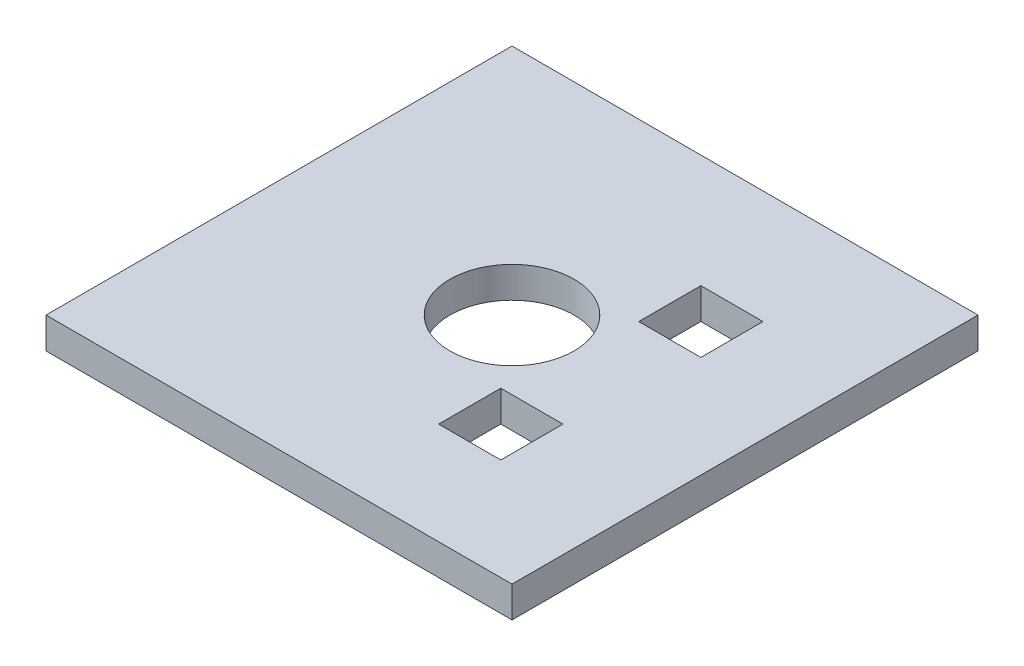
ISO-10303-21;
HEADER;
FILE_DESCRIPTION(('STEP AP214'),'2;1');
FILE_NAME('part.step','',(''),(''),'','','');
FILE_SCHEMA(('AUTOMOTIVE_DESIGN { 1 0 10303 214 1 1 1 1 }'));
ENDSEC;
DATA;
#1=APPLICATION_CONTEXT('core data for automotive mechanical design processes');
#2=APPLICATION_PROTOCOL_DEFINITION('international standard','automotive_design',2000,#1);
#3=PRODUCT_CONTEXT('',#1,'mechanical');
#4=PRODUCT('Part','Part','',(#3));
#5=PRODUCT_RELATED_PRODUCT_CATEGORY('part','',(#4));
#6=PRODUCT_DEFINITION_FORMATION('','',#4);
#7=PRODUCT_DEFINITION_CONTEXT('part definition',#1,'design');
#8=PRODUCT_DEFINITION('design','',#6,#7);
#9=PRODUCT_DEFINITION_SHAPE('','',#8);
#10=(LENGTH_UNIT() NAMED_UNIT(*) SI_UNIT(.MILLI.,.METRE.));
#11=(NAMED_UNIT(*) PLANE_ANGLE_UNIT() SI_UNIT($,.RADIAN.));
#12=(NAMED_UNIT(*) SI_UNIT($,.STERADIAN.) SOLID_ANGLE_UNIT());
#13=UNCERTAINTY_MEASURE_WITH_UNIT(LENGTH_MEASURE(1.E-05),#10,'distance_accuracy_value','');
#14=(GEOMETRIC_REPRESENTATION_CONTEXT(3) GLOBAL_UNCERTAINTY_ASSIGNED_CONTEXT((#13)) GLOBAL_UNIT_ASSIGNED_CONTEXT((#10,
#11,#12)) REPRESENTATION_CONTEXT('',''));
#15=CARTESIAN_POINT('',(0.,0.,0.));
#16=DIRECTION('',(0.,0.,1.));
#17=DIRECTION('',(1.,0.,0.));
#18=AXIS2_PLACEMENT_3D('',#15,#16,#17);
#19=CARTESIAN_POINT('',(0.,10.,0.));
#20=DIRECTION('',(0.,-1.,0.));
#21=DIRECTION('',(0.,0.,-1.));
#22=AXIS2_PLACEMENT_3D('',#19,#20,#21);
#23=PLANE('',#22);
#24=DIRECTION('',(-1.,0.,0.));
#25=VECTOR('',#24,1.);
#26=CARTESIAN_POINT('',(38.5873477613194,10.,22.2049116139431));
#27=LINE('',#26,#25);
#28=CARTESIAN_POINT('',(38.5873477613194,10.,22.2049116139431));
#29=VERTEX_POINT('',#28);
#30=CARTESIAN_POINT('',(18.5873477613194,10.,22.2049116139431));
#31=VERTEX_POINT('',#30);
#32=EDGE_CURVE('E149',#29,#31,#27,.T.);
#33=ORIENTED_EDGE('',*,*,#32,.F.);
#34=DIRECTION('',(0.,0.,-1.));
#35=VECTOR('',#34,1.);
#36=CARTESIAN_POINT('',(38.5873477613194,10.,42.2049116139431));
#37=LINE('',#36,#35);
#38=CARTESIAN_POINT('',(38.5873477613194,10.,42.2049116139431));
#39=VERTEX_POINT('',#38);
#40=EDGE_CURVE('E48',#39,#29,#37,.T.);
#41=ORIENTED_EDGE('',*,*,#40,.F.);
#42=DIRECTION('',(1.,0.,0.));
#43=VECTOR('',#42,1.);
#44=CARTESIAN_POINT('',(38.5873477613194,10.,42.2049116139431));
#45=LINE('',#44,#43);
#46=CARTESIAN_POINT('',(18.5873477613194,10.,42.2049116139431));
#47=VERTEX_POINT('',#46);
#48=EDGE_CURVE('E140',#47,#39,#45,.T.);
#49=ORIENTED_EDGE('',*,*,#48,.F.);
#50=DIRECTION('',(0.,0.,1.));
#51=VECTOR('',#50,1.);
#52=CARTESIAN_POINT('',(18.5873477613194,10.,42.2049116139431));
#53=LINE('',#52,#51);
#54=EDGE_CURVE('E143',#31,#47,#53,.T.);
#55=ORIENTED_EDGE('',*,*,#54,.F.);
#56=EDGE_LOOP('',(#33,#41,#49,#55));
#57=FACE_BOUND('',#56,.T.);
#58=DIRECTION('',(0.,0.,1.));
#59=VECTOR('',#58,1.);
#60=CARTESIAN_POINT('',(22.204911613943,10.,-38.5873477613194));
#61=LINE('',#60,#59);
#62=CARTESIAN_POINT('',(22.204911613943,10.,-38.5873477613194));
#63=VERTEX_POINT('',#62);
#64=CARTESIAN_POINT('',(22.204911613943,10.,-18.5873477613194));
#65=VERTEX_POINT('',#64);
#66=EDGE_CURVE('E174',#63,#65,#61,.T.);
#67=ORIENTED_EDGE('',*,*,#66,.F.);
#68=DIRECTION('',(-1.,0.,0.));
#69=VECTOR('',#68,1.);
#70=CARTESIAN_POINT('',(42.204911613943,10.,-38.5873477613194));
#71=LINE('',#70,#69);
#72=CARTESIAN_POINT('',(42.204911613943,10.,-38.5873477613194));
#73=VERTEX_POINT('',#72);
#74=EDGE_CURVE('E155',#73,#63,#71,.T.);
#75=ORIENTED_EDGE('',*,*,#74,.F.);
#76=DIRECTION('',(0.,0.,-1.));
#77=VECTOR('',#76,1.);
#78=CARTESIAN_POINT('',(42.204911613943,10.,-38.5873477613194));
#79=LINE('',#78,#77);
#80=CARTESIAN_POINT('',(42.204911613943,10.,-18.5873477613194));
#81=VERTEX_POINT('',#80);
#82=EDGE_CURVE('E163',#81,#73,#79,.T.);
#83=ORIENTED_EDGE('',*,*,#82,.F.);
#84=DIRECTION('',(1.,0.,0.));
#85=VECTOR('',#84,1.);
#86=CARTESIAN_POINT('',(42.204911613943,10.,-18.5873477613194));
#87=LINE('',#86,#85);
#88=EDGE_CURVE('E177',#65,#81,#87,.T.);
#89=ORIENTED_EDGE('',*,*,#88,.F.);
#90=EDGE_LOOP('',(#67,#75,#83,#89));
#91=FACE_BOUND('',#90,.T.);
#92=DIRECTION('',(0.,0.,-1.));
#93=VECTOR('',#92,1.);
#94=CARTESIAN_POINT('',(75.,10.,75.));
#95=LINE('',#94,#93);
#96=CARTESIAN_POINT('',(75.,10.,75.));
#97=VERTEX_POINT('',#96);
#98=CARTESIAN_POINT('',(75.,10.,-75.));
#99=VERTEX_POINT('',#98);
#100=EDGE_CURVE('E197',#97,#99,#95,.T.);
#101=ORIENTED_EDGE('',*,*,#100,.T.);
#102=DIRECTION('',(-1.,0.,0.));
#103=VECTOR('',#102,1.);
#104=CARTESIAN_POINT('',(-75.,10.,-75.));
#105=LINE('',#104,#103);
#106=CARTESIAN_POINT('',(-75.,10.,-75.));
#107=VERTEX_POINT('',#106);
#108=EDGE_CURVE('E200',#99,#107,#105,.T.);
#109=ORIENTED_EDGE('',*,*,#108,.T.);
#110=DIRECTION('',(0.,0.,1.));
#111=VECTOR('',#110,1.);
#112=CARTESIAN_POINT('',(-75.,10.,75.));
#113=LINE('',#112,#111);
#114=CARTESIAN_POINT('',(-75.,10.,75.));
#115=VERTEX_POINT('',#114);
#116=EDGE_CURVE('E203',#107,#115,#113,.T.);
#117=ORIENTED_EDGE('',*,*,#116,.T.);
#118=DIRECTION('',(1.,0.,0.));
#119=VECTOR('',#118,1.);
#120=CARTESIAN_POINT('',(-75.,10.,75.));
#121=LINE('',#120,#119);
#122=EDGE_CURVE('E205',#115,#97,#121,.T.);
#123=ORIENTED_EDGE('',*,*,#122,.T.);
#124=EDGE_LOOP('',(#101,#109,#117,#123));
#125=FACE_BOUND('',#124,.T.);
#126=CARTESIAN_POINT('',(0.,10.,0.));
#127=DIRECTION('',(0.,1.,0.));
#128=DIRECTION('',(0.,0.,1.));
#129=AXIS2_PLACEMENT_3D('',#126,#127,#128);
#130=CIRCLE('',#129,20.);
#131=CARTESIAN_POINT('',(0.,10.,20.));
#132=VERTEX_POINT('',#131);
#133=EDGE_CURVE('E191',#132,#132,#130,.T.);
#134=ORIENTED_EDGE('',*,*,#133,.F.);
#135=EDGE_LOOP('',(#134));
#136=FACE_BOUND('',#135,.T.);
#137=ADVANCED_FACE('F33',(#57,#91,#125,#136),#23,.F.);
#138=CARTESIAN_POINT('',(0.,0.,0.));
#139=DIRECTION('',(0.,-1.,0.));
#140=DIRECTION('',(0.,0.,-1.));
#141=AXIS2_PLACEMENT_3D('',#138,#139,#140);
#142=PLANE('',#141);
#143=DIRECTION('',(0.,0.,-1.));
#144=VECTOR('',#143,1.);
#145=CARTESIAN_POINT('',(38.5873477613194,0.,42.2049116139431));
#146=LINE('',#145,#144);
#147=CARTESIAN_POINT('',(38.5873477613194,0.,42.2049116139431));
#148=VERTEX_POINT('',#147);
#149=CARTESIAN_POINT('',(38.5873477613194,0.,22.2049116139431));
#150=VERTEX_POINT('',#149);
#151=EDGE_CURVE('E124',#148,#150,#146,.T.);
#152=ORIENTED_EDGE('',*,*,#151,.T.);
#153=DIRECTION('',(-1.,0.,0.));
#154=VECTOR('',#153,1.);
#155=CARTESIAN_POINT('',(38.5873477613194,0.,22.2049116139431));
#156=LINE('',#155,#154);
#157=CARTESIAN_POINT('',(18.5873477613194,0.,22.2049116139431));
#158=VERTEX_POINT('',#157);
#159=EDGE_CURVE('E133',#150,#158,#156,.T.);
#160=ORIENTED_EDGE('',*,*,#159,.T.);
#161=DIRECTION('',(0.,0.,1.));
#162=VECTOR('',#161,1.);
#163=CARTESIAN_POINT('',(18.5873477613194,0.,42.2049116139431));
#164=LINE('',#163,#162);
#165=CARTESIAN_POINT('',(18.5873477613194,0.,42.2049116139431));
#166=VERTEX_POINT('',#165);
#167=EDGE_CURVE('E56',#158,#166,#164,.T.);
#168=ORIENTED_EDGE('',*,*,#167,.T.);
#169=DIRECTION('',(1.,0.,0.));
#170=VECTOR('',#169,1.);
#171=CARTESIAN_POINT('',(38.5873477613194,0.,42.2049116139431));
#172=LINE('',#171,#170);
#173=EDGE_CURVE('E130',#166,#148,#172,.T.);
#174=ORIENTED_EDGE('',*,*,#173,.T.);
#175=EDGE_LOOP('',(#152,#160,#168,#174));
#176=FACE_BOUND('',#175,.T.);
#177=DIRECTION('',(-1.,0.,0.));
#178=VECTOR('',#177,1.);
#179=CARTESIAN_POINT('',(42.204911613943,0.,-38.5873477613194));
#180=LINE('',#179,#178);
#181=CARTESIAN_POINT('',(42.204911613943,0.,-38.5873477613194));
#182=VERTEX_POINT('',#181);
#183=CARTESIAN_POINT('',(22.204911613943,0.,-38.5873477613194));
#184=VERTEX_POINT('',#183);
#185=EDGE_CURVE('E159',#182,#184,#180,.T.);
#186=ORIENTED_EDGE('',*,*,#185,.T.);
#187=DIRECTION('',(0.,0.,1.));
#188=VECTOR('',#187,1.);
#189=CARTESIAN_POINT('',(22.204911613943,0.,-38.5873477613194));
#190=LINE('',#189,#188);
#191=CARTESIAN_POINT('',(22.204911613943,0.,-18.5873477613194));
#192=VERTEX_POINT('',#191);
#193=EDGE_CURVE('E162',#184,#192,#190,.T.);
#194=ORIENTED_EDGE('',*,*,#193,.T.);
#195=DIRECTION('',(1.,0.,0.));
#196=VECTOR('',#195,1.);
#197=CARTESIAN_POINT('',(42.204911613943,0.,-18.5873477613194));
#198=LINE('',#197,#196);
#199=CARTESIAN_POINT('',(42.204911613943,0.,-18.5873477613194));
#200=VERTEX_POINT('',#199);
#201=EDGE_CURVE('E166',#192,#200,#198,.T.);
#202=ORIENTED_EDGE('',*,*,#201,.T.);
#203=DIRECTION('',(0.,0.,-1.));
#204=VECTOR('',#203,1.);
#205=CARTESIAN_POINT('',(42.204911613943,0.,-38.5873477613194));
#206=LINE('',#205,#204);
#207=EDGE_CURVE('E169',#200,#182,#206,.T.);
#208=ORIENTED_EDGE('',*,*,#207,.T.);
#209=EDGE_LOOP('',(#186,#194,#202,#208));
#210=FACE_BOUND('',#209,.T.);
#211=DIRECTION('',(0.,0.,-1.));
#212=VECTOR('',#211,1.);
#213=CARTESIAN_POINT('',(75.,0.,75.));
#214=LINE('',#213,#212);
#215=CARTESIAN_POINT('',(75.,0.,75.));
#216=VERTEX_POINT('',#215);
#217=CARTESIAN_POINT('',(75.,0.,-75.));
#218=VERTEX_POINT('',#217);
#219=EDGE_CURVE('E194',#216,#218,#214,.T.);
#220=ORIENTED_EDGE('',*,*,#219,.F.);
#221=DIRECTION('',(1.,0.,0.));
#222=VECTOR('',#221,1.);
#223=CARTESIAN_POINT('',(-75.,0.,75.));
#224=LINE('',#223,#222);
#225=CARTESIAN_POINT('',(-75.,0.,75.));
#226=VERTEX_POINT('',#225);
#227=EDGE_CURVE('E201',#226,#216,#224,.T.);
#228=ORIENTED_EDGE('',*,*,#227,.F.);
#229=DIRECTION('',(0.,0.,1.));
#230=VECTOR('',#229,1.);
#231=CARTESIAN_POINT('',(-75.,0.,75.));
#232=LINE('',#231,#230);
#233=CARTESIAN_POINT('',(-75.,0.,-75.));
#234=VERTEX_POINT('',#233);
#235=EDGE_CURVE('E212',#234,#226,#232,.T.);
#236=ORIENTED_EDGE('',*,*,#235,.F.);
#237=DIRECTION('',(-1.,0.,0.));
#238=VECTOR('',#237,1.);
#239=CARTESIAN_POINT('',(-75.,0.,-75.));
#240=LINE('',#239,#238);
#241=EDGE_CURVE('E210',#218,#234,#240,.T.);
#242=ORIENTED_EDGE('',*,*,#241,.F.);
#243=EDGE_LOOP('',(#220,#228,#236,#242));
#244=FACE_BOUND('',#243,.T.);
#245=CARTESIAN_POINT('',(0.,0.,0.));
#246=DIRECTION('',(0.,1.,0.));
#247=DIRECTION('',(0.,0.,1.));
#248=AXIS2_PLACEMENT_3D('',#245,#246,#247);
#249=CIRCLE('',#248,20.);
#250=CARTESIAN_POINT('',(0.,0.,20.));
#251=VERTEX_POINT('',#250);
#252=EDGE_CURVE('E184',#251,#251,#249,.T.);
#253=ORIENTED_EDGE('',*,*,#252,.T.);
#254=EDGE_LOOP('',(#253));
#255=FACE_BOUND('',#254,.T.);
#256=ADVANCED_FACE('F137',(#176,#210,#244,#255),#142,.T.);
#257=CARTESIAN_POINT('',(75.,10.,75.));
#258=DIRECTION('',(-1.,0.,0.));
#259=DIRECTION('',(0.,0.,1.));
#260=AXIS2_PLACEMENT_3D('',#257,#258,#259);
#261=PLANE('',#260);
#262=ORIENTED_EDGE('',*,*,#219,.T.);
#263=DIRECTION('',(0.,-1.,0.));
#264=VECTOR('',#263,1.);
#265=CARTESIAN_POINT('',(75.,10.,-75.));
#266=LINE('',#265,#264);
#267=EDGE_CURVE('E11',#99,#218,#266,.T.);
#268=ORIENTED_EDGE('',*,*,#267,.F.);
#269=ORIENTED_EDGE('',*,*,#100,.F.);
#270=DIRECTION('',(0.,-1.,0.));
#271=VECTOR('',#270,1.);
#272=CARTESIAN_POINT('',(75.,10.,75.));
#273=LINE('',#272,#271);
#274=EDGE_CURVE('E207',#97,#216,#273,.T.);
#275=ORIENTED_EDGE('',*,*,#274,.T.);
#276=EDGE_LOOP('',(#262,#268,#269,#275));
#277=FACE_BOUND('',#276,.T.);
#278=ADVANCED_FACE('F35',(#277),#261,.F.);
#279=CARTESIAN_POINT('',(-75.,10.,-75.));
#280=DIRECTION('',(0.,0.,1.));
#281=DIRECTION('',(1.,0.,0.));
#282=AXIS2_PLACEMENT_3D('',#279,#280,#281);
#283=PLANE('',#282);
#284=ORIENTED_EDGE('',*,*,#241,.T.);
#285=DIRECTION('',(0.,-1.,0.));
#286=VECTOR('',#285,1.);
#287=CARTESIAN_POINT('',(-75.,10.,-75.));
#288=LINE('',#287,#286);
#289=EDGE_CURVE('E41',#107,#234,#288,.T.);
#290=ORIENTED_EDGE('',*,*,#289,.F.);
#291=ORIENTED_EDGE('',*,*,#108,.F.);
#292=ORIENTED_EDGE('',*,*,#267,.T.);
#293=EDGE_LOOP('',(#284,#290,#291,#292));
#294=FACE_BOUND('',#293,.T.);
#295=ADVANCED_FACE('F240',(#294),#283,.F.);
#296=CARTESIAN_POINT('',(-75.,10.,75.));
#297=DIRECTION('',(1.,0.,0.));
#298=DIRECTION('',(0.,0.,-1.));
#299=AXIS2_PLACEMENT_3D('',#296,#297,#298);
#300=PLANE('',#299);
#301=ORIENTED_EDGE('',*,*,#235,.T.);
#302=DIRECTION('',(0.,-1.,0.));
#303=VECTOR('',#302,1.);
#304=CARTESIAN_POINT('',(-75.,10.,75.));
#305=LINE('',#304,#303);
#306=EDGE_CURVE('E217',#115,#226,#305,.T.);
#307=ORIENTED_EDGE('',*,*,#306,.F.);
#308=ORIENTED_EDGE('',*,*,#116,.F.);
#309=ORIENTED_EDGE('',*,*,#289,.T.);
#310=EDGE_LOOP('',(#301,#307,#308,#309));
#311=FACE_BOUND('',#310,.T.);
#312=ADVANCED_FACE('F224',(#311),#300,.F.);
#313=CARTESIAN_POINT('',(-75.,10.,75.));
#314=DIRECTION('',(0.,0.,-1.));
#315=DIRECTION('',(-1.,0.,0.));
#316=AXIS2_PLACEMENT_3D('',#313,#314,#315);
#317=PLANE('',#316);
#318=ORIENTED_EDGE('',*,*,#227,.T.);
#319=ORIENTED_EDGE('',*,*,#274,.F.);
#320=ORIENTED_EDGE('',*,*,#122,.F.);
#321=ORIENTED_EDGE('',*,*,#306,.T.);
#322=EDGE_LOOP('',(#318,#319,#320,#321));
#323=FACE_BOUND('',#322,.T.);
#324=ADVANCED_FACE('F233',(#323),#317,.F.);
#325=CARTESIAN_POINT('',(0.,10.,0.));
#326=DIRECTION('',(0.,-1.,0.));
#327=DIRECTION('',(0.,0.,-1.));
#328=AXIS2_PLACEMENT_3D('',#325,#326,#327);
#329=CYLINDRICAL_SURFACE('',#328,20.);
#330=ORIENTED_EDGE('',*,*,#133,.T.);
#331=EDGE_LOOP('',(#330));
#332=FACE_BOUND('',#331,.T.);
#333=ORIENTED_EDGE('',*,*,#252,.F.);
#334=EDGE_LOOP('',(#333));
#335=FACE_BOUND('',#334,.T.);
#336=ADVANCED_FACE('F256',(#332,#335),#329,.F.);
#337=CARTESIAN_POINT('',(42.204911613943,0.,-38.5873477613194));
#338=DIRECTION('',(0.,0.,-1.));
#339=DIRECTION('',(-1.,0.,0.));
#340=AXIS2_PLACEMENT_3D('',#337,#338,#339);
#341=PLANE('',#340);
#342=ORIENTED_EDGE('',*,*,#74,.T.);
#343=DIRECTION('',(0.,1.,0.));
#344=VECTOR('',#343,1.);
#345=CARTESIAN_POINT('',(22.204911613943,0.,-38.5873477613194));
#346=LINE('',#345,#344);
#347=EDGE_CURVE('E172',#184,#63,#346,.T.);
#348=ORIENTED_EDGE('',*,*,#347,.F.);
#349=ORIENTED_EDGE('',*,*,#185,.F.);
#350=DIRECTION('',(0.,1.,0.));
#351=VECTOR('',#350,1.);
#352=CARTESIAN_POINT('',(42.204911613943,0.,-38.5873477613194));
#353=LINE('',#352,#351);
#354=EDGE_CURVE('E182',#182,#73,#353,.T.);
#355=ORIENTED_EDGE('',*,*,#354,.T.);
#356=EDGE_LOOP('',(#342,#348,#349,#355));
#357=FACE_BOUND('',#356,.T.);
#358=ADVANCED_FACE('F263',(#357),#341,.F.);
#359=CARTESIAN_POINT('',(42.204911613943,0.,-38.5873477613194));
#360=DIRECTION('',(1.,0.,0.));
#361=DIRECTION('',(0.,0.,-1.));
#362=AXIS2_PLACEMENT_3D('',#359,#360,#361);
#363=PLANE('',#362);
#364=ORIENTED_EDGE('',*,*,#82,.T.);
#365=ORIENTED_EDGE('',*,*,#354,.F.);
#366=ORIENTED_EDGE('',*,*,#207,.F.);
#367=DIRECTION('',(0.,1.,0.));
#368=VECTOR('',#367,1.);
#369=CARTESIAN_POINT('',(42.204911613943,0.,-18.5873477613194));
#370=LINE('',#369,#368);
#371=EDGE_CURVE('E185',#200,#81,#370,.T.);
#372=ORIENTED_EDGE('',*,*,#371,.T.);
#373=EDGE_LOOP('',(#364,#365,#366,#372));
#374=FACE_BOUND('',#373,.T.);
#375=ADVANCED_FACE('F268',(#374),#363,.F.);
#376=CARTESIAN_POINT('',(42.204911613943,0.,-18.5873477613194));
#377=DIRECTION('',(0.,0.,1.));
#378=DIRECTION('',(1.,0.,0.));
#379=AXIS2_PLACEMENT_3D('',#376,#377,#378);
#380=PLANE('',#379);
#381=ORIENTED_EDGE('',*,*,#88,.T.);
#382=ORIENTED_EDGE('',*,*,#371,.F.);
#383=ORIENTED_EDGE('',*,*,#201,.F.);
#384=DIRECTION('',(0.,1.,0.));
#385=VECTOR('',#384,1.);
#386=CARTESIAN_POINT('',(22.204911613943,0.,-18.5873477613194));
#387=LINE('',#386,#385);
#388=EDGE_CURVE('E187',#192,#65,#387,.T.);
#389=ORIENTED_EDGE('',*,*,#388,.T.);
#390=EDGE_LOOP('',(#381,#382,#383,#389));
#391=FACE_BOUND('',#390,.T.);
#392=ADVANCED_FACE('F276',(#391),#380,.F.);
#393=CARTESIAN_POINT('',(22.204911613943,0.,-38.5873477613194));
#394=DIRECTION('',(-1.,0.,0.));
#395=DIRECTION('',(0.,0.,1.));
#396=AXIS2_PLACEMENT_3D('',#393,#394,#395);
#397=PLANE('',#396);
#398=ORIENTED_EDGE('',*,*,#66,.T.);
#399=ORIENTED_EDGE('',*,*,#388,.F.);
#400=ORIENTED_EDGE('',*,*,#193,.F.);
#401=ORIENTED_EDGE('',*,*,#347,.T.);
#402=EDGE_LOOP('',(#398,#399,#400,#401));
#403=FACE_BOUND('',#402,.T.);
#404=ADVANCED_FACE('F280',(#403),#397,.F.);
#405=CARTESIAN_POINT('',(38.5873477613194,0.,42.2049116139431));
#406=DIRECTION('',(1.,0.,0.));
#407=DIRECTION('',(0.,0.,-1.));
#408=AXIS2_PLACEMENT_3D('',#405,#406,#407);
#409=PLANE('',#408);
#410=ORIENTED_EDGE('',*,*,#40,.T.);
#411=DIRECTION('',(0.,1.,0.));
#412=VECTOR('',#411,1.);
#413=CARTESIAN_POINT('',(38.5873477613194,0.,22.2049116139431));
#414=LINE('',#413,#412);
#415=EDGE_CURVE('E120',#150,#29,#414,.T.);
#416=ORIENTED_EDGE('',*,*,#415,.F.);
#417=ORIENTED_EDGE('',*,*,#151,.F.);
#418=DIRECTION('',(0.,1.,0.));
#419=VECTOR('',#418,1.);
#420=CARTESIAN_POINT('',(38.5873477613194,0.,42.2049116139431));
#421=LINE('',#420,#419);
#422=EDGE_CURVE('E153',#148,#39,#421,.T.);
#423=ORIENTED_EDGE('',*,*,#422,.T.);
#424=EDGE_LOOP('',(#410,#416,#417,#423));
#425=FACE_BOUND('',#424,.T.);
#426=ADVANCED_FACE('F122',(#425),#409,.F.);
#427=CARTESIAN_POINT('',(38.5873477613194,0.,42.2049116139431));
#428=DIRECTION('',(0.,0.,1.));
#429=DIRECTION('',(1.,0.,0.));
#430=AXIS2_PLACEMENT_3D('',#427,#428,#429);
#431=PLANE('',#430);
#432=ORIENTED_EDGE('',*,*,#48,.T.);
#433=ORIENTED_EDGE('',*,*,#422,.F.);
#434=ORIENTED_EDGE('',*,*,#173,.F.);
#435=DIRECTION('',(0.,1.,0.));
#436=VECTOR('',#435,1.);
#437=CARTESIAN_POINT('',(18.5873477613194,0.,42.2049116139431));
#438=LINE('',#437,#436);
#439=EDGE_CURVE('E156',#166,#47,#438,.T.);
#440=ORIENTED_EDGE('',*,*,#439,.T.);
#441=EDGE_LOOP('',(#432,#433,#434,#440));
#442=FACE_BOUND('',#441,.T.);
#443=ADVANCED_FACE('F289',(#442),#431,.F.);
#444=CARTESIAN_POINT('',(18.5873477613194,0.,42.2049116139431));
#445=DIRECTION('',(-1.,0.,0.));
#446=DIRECTION('',(0.,0.,1.));
#447=AXIS2_PLACEMENT_3D('',#444,#445,#446);
#448=PLANE('',#447);
#449=ORIENTED_EDGE('',*,*,#54,.T.);
#450=ORIENTED_EDGE('',*,*,#439,.F.);
#451=ORIENTED_EDGE('',*,*,#167,.F.);
#452=DIRECTION('',(0.,1.,0.));
#453=VECTOR('',#452,1.);
#454=CARTESIAN_POINT('',(18.5873477613194,0.,22.2049116139431));
#455=LINE('',#454,#453);
#456=EDGE_CURVE('E129',#158,#31,#455,.T.);
#457=ORIENTED_EDGE('',*,*,#456,.T.);
#458=EDGE_LOOP('',(#449,#450,#451,#457));
#459=FACE_BOUND('',#458,.T.);
#460=ADVANCED_FACE('F292',(#459),#448,.F.);
#461=CARTESIAN_POINT('',(38.5873477613194,0.,22.2049116139431));
#462=DIRECTION('',(0.,0.,-1.));
#463=DIRECTION('',(-1.,0.,0.));
#464=AXIS2_PLACEMENT_3D('',#461,#462,#463);
#465=PLANE('',#464);
#466=ORIENTED_EDGE('',*,*,#32,.T.);
#467=ORIENTED_EDGE('',*,*,#456,.F.);
#468=ORIENTED_EDGE('',*,*,#159,.F.);
#469=ORIENTED_EDGE('',*,*,#415,.T.);
#470=EDGE_LOOP('',(#466,#467,#468,#469));
#471=FACE_BOUND('',#470,.T.);
#472=ADVANCED_FACE('F134',(#471),#465,.F.);
#473=CLOSED_SHELL('',(#137,#256,#278,#295,#312,#324,#336,#358,#375,#392,#404,#426,#443,#460,#472));
#474=MANIFOLD_SOLID_BREP('B2',#473);
#475=ADVANCED_BREP_SHAPE_REPRESENTATION('',(#18,#474),#14);
#476=SHAPE_DEFINITION_REPRESENTATION(#9,#475);
ENDSEC;
END-ISO-10303-21;
